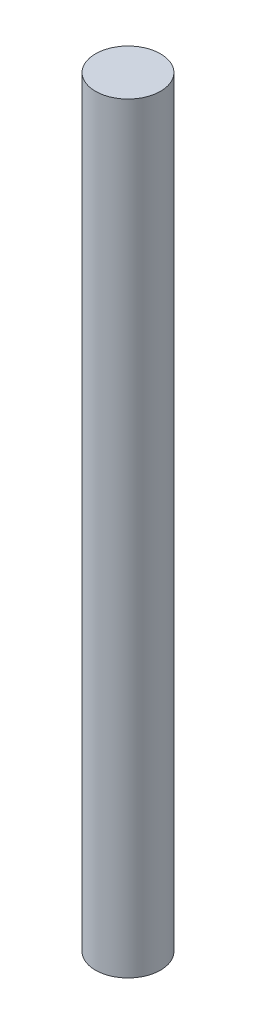
ISO-10303-21;
HEADER;
FILE_DESCRIPTION(('STEP AP214'),'2;1');
FILE_NAME('part.step','',(''),(''),'','','');
FILE_SCHEMA(('AUTOMOTIVE_DESIGN { 1 0 10303 214 1 1 1 1 }'));
ENDSEC;
DATA;
#1=APPLICATION_CONTEXT('core data for automotive mechanical design processes');
#2=APPLICATION_PROTOCOL_DEFINITION('international standard','automotive_design',2000,#1);
#3=PRODUCT_CONTEXT('',#1,'mechanical');
#4=PRODUCT('Part','Part','',(#3));
#5=PRODUCT_RELATED_PRODUCT_CATEGORY('part','',(#4));
#6=PRODUCT_DEFINITION_FORMATION('','',#4);
#7=PRODUCT_DEFINITION_CONTEXT('part definition',#1,'design');
#8=PRODUCT_DEFINITION('design','',#6,#7);
#9=PRODUCT_DEFINITION_SHAPE('','',#8);
#10=(LENGTH_UNIT() NAMED_UNIT(*) SI_UNIT(.MILLI.,.METRE.));
#11=(NAMED_UNIT(*) PLANE_ANGLE_UNIT() SI_UNIT($,.RADIAN.));
#12=(NAMED_UNIT(*) SI_UNIT($,.STERADIAN.) SOLID_ANGLE_UNIT());
#13=UNCERTAINTY_MEASURE_WITH_UNIT(LENGTH_MEASURE(1.E-05),#10,'distance_accuracy_value','');
#14=(GEOMETRIC_REPRESENTATION_CONTEXT(3) GLOBAL_UNCERTAINTY_ASSIGNED_CONTEXT((#13)) GLOBAL_UNIT_ASSIGNED_CONTEXT((#10,
#11,#12)) REPRESENTATION_CONTEXT('',''));
#15=CARTESIAN_POINT('',(0.,0.,0.));
#16=DIRECTION('',(0.,0.,1.));
#17=DIRECTION('',(1.,0.,0.));
#18=AXIS2_PLACEMENT_3D('',#15,#16,#17);
#19=CARTESIAN_POINT('',(0.,6.096,0.));
#20=DIRECTION('',(0.,-1.,0.));
#21=DIRECTION('',(0.,0.,-1.));
#22=AXIS2_PLACEMENT_3D('',#19,#20,#21);
#23=CYLINDRICAL_SURFACE('',#22,0.5207);
#24=CARTESIAN_POINT('',(0.,6.096,0.));
#25=DIRECTION('',(0.,1.,0.));
#26=DIRECTION('',(0.,0.,1.));
#27=AXIS2_PLACEMENT_3D('',#24,#25,#26);
#28=CIRCLE('',#27,0.5207);
#29=CARTESIAN_POINT('',(0.,6.096,0.5207));
#30=VERTEX_POINT('',#29);
#31=EDGE_CURVE('E10',#30,#30,#28,.T.);
#32=ORIENTED_EDGE('',*,*,#31,.F.);
#33=EDGE_LOOP('',(#32));
#34=FACE_BOUND('',#33,.T.);
#35=CARTESIAN_POINT('',(0.,-6.096,0.));
#36=DIRECTION('',(0.,1.,0.));
#37=DIRECTION('',(0.,0.,1.));
#38=AXIS2_PLACEMENT_3D('',#35,#36,#37);
#39=CIRCLE('',#38,0.5207);
#40=CARTESIAN_POINT('',(0.,-6.096,0.5207));
#41=VERTEX_POINT('',#40);
#42=EDGE_CURVE('E34',#41,#41,#39,.T.);
#43=ORIENTED_EDGE('',*,*,#42,.T.);
#44=EDGE_LOOP('',(#43));
#45=FACE_BOUND('',#44,.T.);
#46=ADVANCED_FACE('F31',(#34,#45),#23,.T.);
#47=CARTESIAN_POINT('',(0.,6.096,0.));
#48=DIRECTION('',(0.,1.,0.));
#49=DIRECTION('',(0.,0.,1.));
#50=AXIS2_PLACEMENT_3D('',#47,#48,#49);
#51=PLANE('',#50);
#52=ORIENTED_EDGE('',*,*,#31,.T.);
#53=EDGE_LOOP('',(#52));
#54=FACE_BOUND('',#53,.T.);
#55=ADVANCED_FACE('F46',(#54),#51,.T.);
#56=CARTESIAN_POINT('',(0.,-6.096,0.));
#57=DIRECTION('',(0.,1.,0.));
#58=DIRECTION('',(0.,0.,1.));
#59=AXIS2_PLACEMENT_3D('',#56,#57,#58);
#60=PLANE('',#59);
#61=ORIENTED_EDGE('',*,*,#42,.F.);
#62=EDGE_LOOP('',(#61));
#63=FACE_BOUND('',#62,.T.);
#64=ADVANCED_FACE('F44',(#63),#60,.F.);
#65=CLOSED_SHELL('',(#46,#55,#64));
#66=MANIFOLD_SOLID_BREP('B2',#65);
#67=ADVANCED_BREP_SHAPE_REPRESENTATION('',(#18,#66),#14);
#68=SHAPE_DEFINITION_REPRESENTATION(#9,#67);
ENDSEC;
END-ISO-10303-21;
